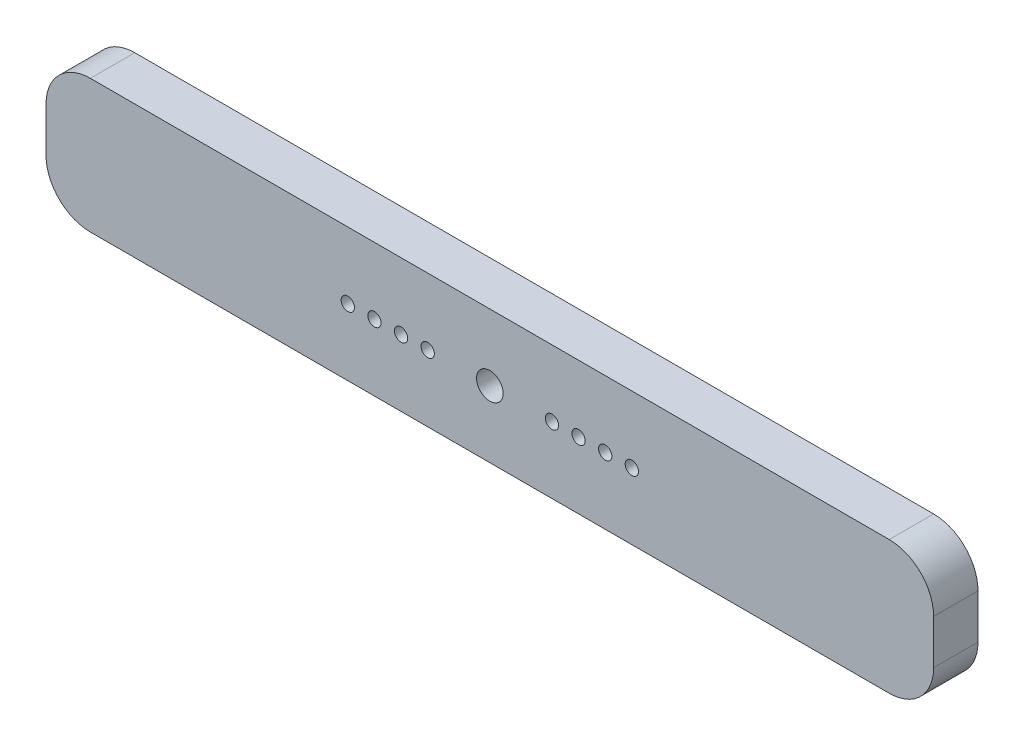
ISO-10303-21;
HEADER;
FILE_DESCRIPTION(('STEP AP214'),'2;1');
FILE_NAME('part.step','',(''),(''),'','','');
FILE_SCHEMA(('AUTOMOTIVE_DESIGN { 1 0 10303 214 1 1 1 1 }'));
ENDSEC;
DATA;
#1=APPLICATION_CONTEXT('core data for automotive mechanical design processes');
#2=APPLICATION_PROTOCOL_DEFINITION('international standard','automotive_design',2000,#1);
#3=PRODUCT_CONTEXT('',#1,'mechanical');
#4=PRODUCT('Part','Part','',(#3));
#5=PRODUCT_RELATED_PRODUCT_CATEGORY('part','',(#4));
#6=PRODUCT_DEFINITION_FORMATION('','',#4);
#7=PRODUCT_DEFINITION_CONTEXT('part definition',#1,'design');
#8=PRODUCT_DEFINITION('design','',#6,#7);
#9=PRODUCT_DEFINITION_SHAPE('','',#8);
#10=(LENGTH_UNIT() NAMED_UNIT(*) SI_UNIT(.MILLI.,.METRE.));
#11=(NAMED_UNIT(*) PLANE_ANGLE_UNIT() SI_UNIT($,.RADIAN.));
#12=(NAMED_UNIT(*) SI_UNIT($,.STERADIAN.) SOLID_ANGLE_UNIT());
#13=UNCERTAINTY_MEASURE_WITH_UNIT(LENGTH_MEASURE(1.E-05),#10,'distance_accuracy_value','');
#14=(GEOMETRIC_REPRESENTATION_CONTEXT(3) GLOBAL_UNCERTAINTY_ASSIGNED_CONTEXT((#13)) GLOBAL_UNIT_ASSIGNED_CONTEXT((#10,
#11,#12)) REPRESENTATION_CONTEXT('',''));
#15=CARTESIAN_POINT('',(0.,0.,0.));
#16=DIRECTION('',(0.,0.,1.));
#17=DIRECTION('',(1.,0.,0.));
#18=AXIS2_PLACEMENT_3D('',#15,#16,#17);
#19=CARTESIAN_POINT('',(-133.131313131313,-5.,5.));
#20=DIRECTION('',(0.,1.,0.));
#21=DIRECTION('',(0.,0.,1.));
#22=AXIS2_PLACEMENT_3D('',#19,#20,#21);
#23=PLANE('',#22);
#24=DIRECTION('',(1.,0.,0.));
#25=VECTOR('',#24,1.);
#26=CARTESIAN_POINT('',(-133.131313131313,-5.,0.));
#27=LINE('',#26,#25);
#28=CARTESIAN_POINT('',(-103.131313131313,-5.,0.));
#29=VERTEX_POINT('',#28);
#30=CARTESIAN_POINT('',(-13.1313131313131,-5.,0.));
#31=VERTEX_POINT('',#30);
#32=EDGE_CURVE('E219',#29,#31,#27,.T.);
#33=ORIENTED_EDGE('',*,*,#32,.T.);
#34=DIRECTION('',(0.,0.,-1.));
#35=VECTOR('',#34,1.);
#36=CARTESIAN_POINT('',(-13.1313131313131,-5.,5.00000000000001));
#37=LINE('',#36,#35);
#38=CARTESIAN_POINT('',(-13.1313131313131,-5.,5.));
#39=VERTEX_POINT('',#38);
#40=EDGE_CURVE('E48',#31,#39,#37,.F.);
#41=ORIENTED_EDGE('',*,*,#40,.T.);
#42=DIRECTION('',(1.,0.,0.));
#43=VECTOR('',#42,1.);
#44=CARTESIAN_POINT('',(-133.131313131313,-5.,5.));
#45=LINE('',#44,#43);
#46=CARTESIAN_POINT('',(-103.131313131313,-5.,5.));
#47=VERTEX_POINT('',#46);
#48=EDGE_CURVE('E120',#47,#39,#45,.T.);
#49=ORIENTED_EDGE('',*,*,#48,.F.);
#50=DIRECTION('',(0.,0.,-1.));
#51=VECTOR('',#50,1.);
#52=CARTESIAN_POINT('',(-103.131313131313,-5.,0.));
#53=LINE('',#52,#51);
#54=EDGE_CURVE('E109',#47,#29,#53,.T.);
#55=ORIENTED_EDGE('',*,*,#54,.T.);
#56=EDGE_LOOP('',(#33,#41,#49,#55));
#57=FACE_BOUND('',#56,.T.);
#58=ADVANCED_FACE('F33',(#57),#23,.F.);
#59=CARTESIAN_POINT('',(-133.131313131313,10.,5.));
#60=DIRECTION('',(0.,-1.,0.));
#61=DIRECTION('',(0.,0.,-1.));
#62=AXIS2_PLACEMENT_3D('',#59,#60,#61);
#63=PLANE('',#62);
#64=DIRECTION('',(-1.,0.,0.));
#65=VECTOR('',#64,1.);
#66=CARTESIAN_POINT('',(-133.131313131313,10.,5.));
#67=LINE('',#66,#65);
#68=CARTESIAN_POINT('',(-13.1313131313131,10.,5.));
#69=VERTEX_POINT('',#68);
#70=CARTESIAN_POINT('',(-103.131313131313,10.,5.));
#71=VERTEX_POINT('',#70);
#72=EDGE_CURVE('E102',#69,#71,#67,.T.);
#73=ORIENTED_EDGE('',*,*,#72,.F.);
#74=DIRECTION('',(0.,0.,-1.));
#75=VECTOR('',#74,1.);
#76=CARTESIAN_POINT('',(-13.1313131313131,10.,0.));
#77=LINE('',#76,#75);
#78=CARTESIAN_POINT('',(-13.1313131313131,10.,0.));
#79=VERTEX_POINT('',#78);
#80=EDGE_CURVE('E116',#69,#79,#77,.T.);
#81=ORIENTED_EDGE('',*,*,#80,.T.);
#82=DIRECTION('',(-1.,0.,0.));
#83=VECTOR('',#82,1.);
#84=CARTESIAN_POINT('',(-133.131313131313,10.,0.));
#85=LINE('',#84,#83);
#86=CARTESIAN_POINT('',(-103.131313131313,10.,0.));
#87=VERTEX_POINT('',#86);
#88=EDGE_CURVE('E222',#79,#87,#85,.T.);
#89=ORIENTED_EDGE('',*,*,#88,.T.);
#90=DIRECTION('',(0.,0.,-1.));
#91=VECTOR('',#90,1.);
#92=CARTESIAN_POINT('',(-103.131313131313,10.,5.00000000000001));
#93=LINE('',#92,#91);
#94=EDGE_CURVE('E119',#87,#71,#93,.F.);
#95=ORIENTED_EDGE('',*,*,#94,.T.);
#96=EDGE_LOOP('',(#73,#81,#89,#95));
#97=FACE_BOUND('',#96,.T.);
#98=ADVANCED_FACE('F114',(#97),#63,.F.);
#99=CARTESIAN_POINT('',(0.,0.,5.));
#100=DIRECTION('',(0.,0.,1.));
#101=DIRECTION('',(1.,0.,0.));
#102=AXIS2_PLACEMENT_3D('',#99,#100,#101);
#103=PLANE('',#102);
#104=CARTESIAN_POINT('',(-74.1313131313131,2.5,5.));
#105=DIRECTION('',(0.,0.,1.));
#106=DIRECTION('',(1.,0.,0.));
#107=AXIS2_PLACEMENT_3D('',#104,#105,#106);
#108=CIRCLE('',#107,0.749999999999999);
#109=CARTESIAN_POINT('',(-73.3813131313131,2.5,5.));
#110=VERTEX_POINT('',#109);
#111=EDGE_CURVE('E199',#110,#110,#108,.T.);
#112=ORIENTED_EDGE('',*,*,#111,.F.);
#113=EDGE_LOOP('',(#112));
#114=FACE_BOUND('',#113,.T.);
#115=CARTESIAN_POINT('',(-45.1313131313131,2.5,5.));
#116=DIRECTION('',(0.,0.,1.));
#117=DIRECTION('',(1.,0.,0.));
#118=AXIS2_PLACEMENT_3D('',#115,#116,#117);
#119=CIRCLE('',#118,0.749999999999999);
#120=CARTESIAN_POINT('',(-44.3813131313131,2.5,5.));
#121=VERTEX_POINT('',#120);
#122=EDGE_CURVE('E192',#121,#121,#119,.T.);
#123=ORIENTED_EDGE('',*,*,#122,.F.);
#124=EDGE_LOOP('',(#123));
#125=FACE_BOUND('',#124,.T.);
#126=CARTESIAN_POINT('',(-48.1313131313131,2.5,5.));
#127=DIRECTION('',(0.,0.,1.));
#128=DIRECTION('',(1.,0.,0.));
#129=AXIS2_PLACEMENT_3D('',#126,#127,#128);
#130=CIRCLE('',#129,0.749999999999999);
#131=CARTESIAN_POINT('',(-47.3813131313131,2.5,5.));
#132=VERTEX_POINT('',#131);
#133=EDGE_CURVE('E211',#132,#132,#130,.T.);
#134=ORIENTED_EDGE('',*,*,#133,.F.);
#135=EDGE_LOOP('',(#134));
#136=FACE_BOUND('',#135,.T.);
#137=CARTESIAN_POINT('',(-51.1313131313131,2.5,5.));
#138=DIRECTION('',(0.,0.,1.));
#139=DIRECTION('',(1.,0.,0.));
#140=AXIS2_PLACEMENT_3D('',#137,#138,#139);
#141=CIRCLE('',#140,0.749999999999999);
#142=CARTESIAN_POINT('',(-50.3813131313131,2.5,5.));
#143=VERTEX_POINT('',#142);
#144=EDGE_CURVE('E204',#143,#143,#141,.T.);
#145=ORIENTED_EDGE('',*,*,#144,.F.);
#146=EDGE_LOOP('',(#145));
#147=FACE_BOUND('',#146,.T.);
#148=CARTESIAN_POINT('',(-42.1313131313131,2.5,5.));
#149=DIRECTION('',(0.,0.,1.));
#150=DIRECTION('',(-1.,0.,0.));
#151=AXIS2_PLACEMENT_3D('',#148,#149,#150);
#152=CIRCLE('',#151,0.749999999999999);
#153=CARTESIAN_POINT('',(-42.8813131313131,2.5,5.));
#154=VERTEX_POINT('',#153);
#155=EDGE_CURVE('E175',#154,#154,#152,.T.);
#156=ORIENTED_EDGE('',*,*,#155,.F.);
#157=EDGE_LOOP('',(#156));
#158=FACE_BOUND('',#157,.T.);
#159=CARTESIAN_POINT('',(-71.1313131313131,2.49999999999999,5.));
#160=DIRECTION('',(0.,0.,1.));
#161=DIRECTION('',(-1.,0.,0.));
#162=AXIS2_PLACEMENT_3D('',#159,#160,#161);
#163=CIRCLE('',#162,0.749999999999999);
#164=CARTESIAN_POINT('',(-71.8813131313131,2.49999999999999,5.));
#165=VERTEX_POINT('',#164);
#166=EDGE_CURVE('E168',#165,#165,#163,.T.);
#167=ORIENTED_EDGE('',*,*,#166,.F.);
#168=EDGE_LOOP('',(#167));
#169=FACE_BOUND('',#168,.T.);
#170=CARTESIAN_POINT('',(-68.1313131313131,2.5,5.));
#171=DIRECTION('',(0.,0.,1.));
#172=DIRECTION('',(-1.,0.,0.));
#173=AXIS2_PLACEMENT_3D('',#170,#171,#172);
#174=CIRCLE('',#173,0.749999999999999);
#175=CARTESIAN_POINT('',(-68.8813131313131,2.5,5.));
#176=VERTEX_POINT('',#175);
#177=EDGE_CURVE('E187',#176,#176,#174,.T.);
#178=ORIENTED_EDGE('',*,*,#177,.F.);
#179=EDGE_LOOP('',(#178));
#180=FACE_BOUND('',#179,.T.);
#181=CARTESIAN_POINT('',(-65.1313131313131,2.5,5.));
#182=DIRECTION('',(0.,0.,1.));
#183=DIRECTION('',(-1.,0.,0.));
#184=AXIS2_PLACEMENT_3D('',#181,#182,#183);
#185=CIRCLE('',#184,0.749999999999999);
#186=CARTESIAN_POINT('',(-65.8813131313131,2.5,5.));
#187=VERTEX_POINT('',#186);
#188=EDGE_CURVE('E180',#187,#187,#185,.T.);
#189=ORIENTED_EDGE('',*,*,#188,.F.);
#190=EDGE_LOOP('',(#189));
#191=FACE_BOUND('',#190,.T.);
#192=CARTESIAN_POINT('',(-58.1313131313131,2.5,5.));
#193=DIRECTION('',(0.,0.,1.));
#194=DIRECTION('',(1.,0.,0.));
#195=AXIS2_PLACEMENT_3D('',#192,#193,#194);
#196=CIRCLE('',#195,1.5);
#197=CARTESIAN_POINT('',(-56.6313131313131,2.5,5.));
#198=VERTEX_POINT('',#197);
#199=EDGE_CURVE('E216',#198,#198,#196,.T.);
#200=ORIENTED_EDGE('',*,*,#199,.F.);
#201=EDGE_LOOP('',(#200));
#202=FACE_BOUND('',#201,.T.);
#203=DIRECTION('',(0.,1.,0.));
#204=VECTOR('',#203,1.);
#205=CARTESIAN_POINT('',(-8.13131313131313,0.,5.));
#206=LINE('',#205,#204);
#207=CARTESIAN_POINT('',(-8.13131313131313,0.,5.));
#208=VERTEX_POINT('',#207);
#209=CARTESIAN_POINT('',(-8.13131313131313,5.,5.));
#210=VERTEX_POINT('',#209);
#211=EDGE_CURVE('E105',#208,#210,#206,.T.);
#212=ORIENTED_EDGE('',*,*,#211,.T.);
#213=CARTESIAN_POINT('',(-13.1313131313131,5.,5.));
#214=DIRECTION('',(0.,0.,1.));
#215=DIRECTION('',(1.,0.,0.));
#216=AXIS2_PLACEMENT_3D('',#213,#214,#215);
#217=CIRCLE('',#216,5.);
#218=EDGE_CURVE('E99',#210,#69,#217,.T.);
#219=ORIENTED_EDGE('',*,*,#218,.T.);
#220=ORIENTED_EDGE('',*,*,#72,.T.);
#221=CARTESIAN_POINT('',(-103.131313131313,5.,5.));
#222=DIRECTION('',(0.,0.,1.));
#223=DIRECTION('',(1.,0.,0.));
#224=AXIS2_PLACEMENT_3D('',#221,#222,#223);
#225=CIRCLE('',#224,5.);
#226=CARTESIAN_POINT('',(-108.131313131313,5.,5.));
#227=VERTEX_POINT('',#226);
#228=EDGE_CURVE('E140',#71,#227,#225,.T.);
#229=ORIENTED_EDGE('',*,*,#228,.T.);
#230=DIRECTION('',(0.,-1.,0.));
#231=VECTOR('',#230,1.);
#232=CARTESIAN_POINT('',(-108.131313131313,0.,5.));
#233=LINE('',#232,#231);
#234=CARTESIAN_POINT('',(-108.131313131313,0.,5.));
#235=VERTEX_POINT('',#234);
#236=EDGE_CURVE('E155',#227,#235,#233,.T.);
#237=ORIENTED_EDGE('',*,*,#236,.T.);
#238=CARTESIAN_POINT('',(-103.131313131313,0.,5.));
#239=DIRECTION('',(0.,0.,1.));
#240=DIRECTION('',(1.,0.,0.));
#241=AXIS2_PLACEMENT_3D('',#238,#239,#240);
#242=CIRCLE('',#241,5.);
#243=EDGE_CURVE('E55',#235,#47,#242,.T.);
#244=ORIENTED_EDGE('',*,*,#243,.T.);
#245=ORIENTED_EDGE('',*,*,#48,.T.);
#246=CARTESIAN_POINT('',(-13.1313131313131,0.,5.));
#247=DIRECTION('',(0.,0.,1.));
#248=DIRECTION('',(1.,0.,0.));
#249=AXIS2_PLACEMENT_3D('',#246,#247,#248);
#250=CIRCLE('',#249,5.);
#251=EDGE_CURVE('E110',#39,#208,#250,.T.);
#252=ORIENTED_EDGE('',*,*,#251,.T.);
#253=EDGE_LOOP('',(#212,#219,#220,#229,#237,#244,#245,#252));
#254=FACE_BOUND('',#253,.T.);
#255=ADVANCED_FACE('F101',(#114,#125,#136,#147,#158,#169,#180,#191,#202,#254),#103,.T.);
#256=CARTESIAN_POINT('',(0.,0.,0.));
#257=DIRECTION('',(0.,0.,1.));
#258=DIRECTION('',(1.,0.,0.));
#259=AXIS2_PLACEMENT_3D('',#256,#257,#258);
#260=PLANE('',#259);
#261=CARTESIAN_POINT('',(-74.1313131313131,2.5,0.));
#262=DIRECTION('',(0.,0.,1.));
#263=DIRECTION('',(1.,0.,0.));
#264=AXIS2_PLACEMENT_3D('',#261,#262,#263);
#265=CIRCLE('',#264,0.749999999999999);
#266=CARTESIAN_POINT('',(-73.3813131313131,2.5,0.));
#267=VERTEX_POINT('',#266);
#268=EDGE_CURVE('E183',#267,#267,#265,.T.);
#269=ORIENTED_EDGE('',*,*,#268,.T.);
#270=EDGE_LOOP('',(#269));
#271=FACE_BOUND('',#270,.T.);
#272=CARTESIAN_POINT('',(-45.1313131313131,2.5,0.));
#273=DIRECTION('',(0.,0.,1.));
#274=DIRECTION('',(1.,0.,0.));
#275=AXIS2_PLACEMENT_3D('',#272,#273,#274);
#276=CIRCLE('',#275,0.749999999999999);
#277=CARTESIAN_POINT('',(-44.3813131313131,2.5,0.));
#278=VERTEX_POINT('',#277);
#279=EDGE_CURVE('E196',#278,#278,#276,.T.);
#280=ORIENTED_EDGE('',*,*,#279,.T.);
#281=EDGE_LOOP('',(#280));
#282=FACE_BOUND('',#281,.T.);
#283=CARTESIAN_POINT('',(-48.1313131313131,2.5,0.));
#284=DIRECTION('',(0.,0.,1.));
#285=DIRECTION('',(1.,0.,0.));
#286=AXIS2_PLACEMENT_3D('',#283,#284,#285);
#287=CIRCLE('',#286,0.749999999999999);
#288=CARTESIAN_POINT('',(-47.3813131313131,2.5,0.));
#289=VERTEX_POINT('',#288);
#290=EDGE_CURVE('E195',#289,#289,#287,.T.);
#291=ORIENTED_EDGE('',*,*,#290,.T.);
#292=EDGE_LOOP('',(#291));
#293=FACE_BOUND('',#292,.T.);
#294=CARTESIAN_POINT('',(-51.1313131313131,2.5,0.));
#295=DIRECTION('',(0.,0.,1.));
#296=DIRECTION('',(1.,0.,0.));
#297=AXIS2_PLACEMENT_3D('',#294,#295,#296);
#298=CIRCLE('',#297,0.749999999999999);
#299=CARTESIAN_POINT('',(-50.3813131313131,2.5,0.));
#300=VERTEX_POINT('',#299);
#301=EDGE_CURVE('E208',#300,#300,#298,.T.);
#302=ORIENTED_EDGE('',*,*,#301,.T.);
#303=EDGE_LOOP('',(#302));
#304=FACE_BOUND('',#303,.T.);
#305=CARTESIAN_POINT('',(-42.1313131313131,2.5,0.));
#306=DIRECTION('',(0.,0.,1.));
#307=DIRECTION('',(-1.,0.,0.));
#308=AXIS2_PLACEMENT_3D('',#305,#306,#307);
#309=CIRCLE('',#308,0.749999999999999);
#310=CARTESIAN_POINT('',(-42.8813131313131,2.5,0.));
#311=VERTEX_POINT('',#310);
#312=EDGE_CURVE('E167',#311,#311,#309,.T.);
#313=ORIENTED_EDGE('',*,*,#312,.T.);
#314=EDGE_LOOP('',(#313));
#315=FACE_BOUND('',#314,.T.);
#316=CARTESIAN_POINT('',(-71.1313131313131,2.49999999999999,0.));
#317=DIRECTION('',(0.,0.,1.));
#318=DIRECTION('',(-1.,0.,0.));
#319=AXIS2_PLACEMENT_3D('',#316,#317,#318);
#320=CIRCLE('',#319,0.749999999999999);
#321=CARTESIAN_POINT('',(-71.8813131313131,2.49999999999999,0.));
#322=VERTEX_POINT('',#321);
#323=EDGE_CURVE('E172',#322,#322,#320,.T.);
#324=ORIENTED_EDGE('',*,*,#323,.T.);
#325=EDGE_LOOP('',(#324));
#326=FACE_BOUND('',#325,.T.);
#327=CARTESIAN_POINT('',(-68.1313131313131,2.5,0.));
#328=DIRECTION('',(0.,0.,1.));
#329=DIRECTION('',(-1.,0.,0.));
#330=AXIS2_PLACEMENT_3D('',#327,#328,#329);
#331=CIRCLE('',#330,0.749999999999999);
#332=CARTESIAN_POINT('',(-68.8813131313131,2.5,0.));
#333=VERTEX_POINT('',#332);
#334=EDGE_CURVE('E171',#333,#333,#331,.T.);
#335=ORIENTED_EDGE('',*,*,#334,.T.);
#336=EDGE_LOOP('',(#335));
#337=FACE_BOUND('',#336,.T.);
#338=CARTESIAN_POINT('',(-65.1313131313131,2.5,0.));
#339=DIRECTION('',(0.,0.,1.));
#340=DIRECTION('',(-1.,0.,0.));
#341=AXIS2_PLACEMENT_3D('',#338,#339,#340);
#342=CIRCLE('',#341,0.749999999999999);
#343=CARTESIAN_POINT('',(-65.8813131313131,2.5,0.));
#344=VERTEX_POINT('',#343);
#345=EDGE_CURVE('E184',#344,#344,#342,.T.);
#346=ORIENTED_EDGE('',*,*,#345,.T.);
#347=EDGE_LOOP('',(#346));
#348=FACE_BOUND('',#347,.T.);
#349=CARTESIAN_POINT('',(-58.1313131313131,2.5,0.));
#350=DIRECTION('',(0.,0.,1.));
#351=DIRECTION('',(1.,0.,0.));
#352=AXIS2_PLACEMENT_3D('',#349,#350,#351);
#353=CIRCLE('',#352,1.5);
#354=CARTESIAN_POINT('',(-56.6313131313131,2.5,0.));
#355=VERTEX_POINT('',#354);
#356=EDGE_CURVE('E207',#355,#355,#353,.T.);
#357=ORIENTED_EDGE('',*,*,#356,.T.);
#358=EDGE_LOOP('',(#357));
#359=FACE_BOUND('',#358,.T.);
#360=ORIENTED_EDGE('',*,*,#88,.F.);
#361=CARTESIAN_POINT('',(-13.1313131313131,5.,0.));
#362=DIRECTION('',(0.,0.,1.));
#363=DIRECTION('',(1.,0.,0.));
#364=AXIS2_PLACEMENT_3D('',#361,#362,#363);
#365=CIRCLE('',#364,5.);
#366=CARTESIAN_POINT('',(-8.13131313131313,5.,0.));
#367=VERTEX_POINT('',#366);
#368=EDGE_CURVE('E123',#79,#367,#365,.F.);
#369=ORIENTED_EDGE('',*,*,#368,.T.);
#370=DIRECTION('',(0.,-1.,0.));
#371=VECTOR('',#370,1.);
#372=CARTESIAN_POINT('',(-8.13131313131313,10.,0.));
#373=LINE('',#372,#371);
#374=CARTESIAN_POINT('',(-8.13131313131313,0.,0.));
#375=VERTEX_POINT('',#374);
#376=EDGE_CURVE('E160',#367,#375,#373,.T.);
#377=ORIENTED_EDGE('',*,*,#376,.T.);
#378=CARTESIAN_POINT('',(-13.1313131313131,0.,0.));
#379=DIRECTION('',(0.,0.,1.));
#380=DIRECTION('',(1.,0.,0.));
#381=AXIS2_PLACEMENT_3D('',#378,#379,#380);
#382=CIRCLE('',#381,5.);
#383=EDGE_CURVE('E132',#375,#31,#382,.F.);
#384=ORIENTED_EDGE('',*,*,#383,.T.);
#385=ORIENTED_EDGE('',*,*,#32,.F.);
#386=CARTESIAN_POINT('',(-103.131313131313,0.,0.));
#387=DIRECTION('',(0.,0.,1.));
#388=DIRECTION('',(1.,0.,0.));
#389=AXIS2_PLACEMENT_3D('',#386,#387,#388);
#390=CIRCLE('',#389,5.);
#391=CARTESIAN_POINT('',(-108.131313131313,0.,0.));
#392=VERTEX_POINT('',#391);
#393=EDGE_CURVE('E126',#29,#392,#390,.F.);
#394=ORIENTED_EDGE('',*,*,#393,.T.);
#395=DIRECTION('',(0.,1.,0.));
#396=VECTOR('',#395,1.);
#397=CARTESIAN_POINT('',(-108.131313131313,10.,0.));
#398=LINE('',#397,#396);
#399=CARTESIAN_POINT('',(-108.131313131313,5.,0.));
#400=VERTEX_POINT('',#399);
#401=EDGE_CURVE('E153',#392,#400,#398,.T.);
#402=ORIENTED_EDGE('',*,*,#401,.T.);
#403=CARTESIAN_POINT('',(-103.131313131313,5.,0.));
#404=DIRECTION('',(0.,0.,1.));
#405=DIRECTION('',(1.,0.,0.));
#406=AXIS2_PLACEMENT_3D('',#403,#404,#405);
#407=CIRCLE('',#406,5.);
#408=EDGE_CURVE('E124',#400,#87,#407,.F.);
#409=ORIENTED_EDGE('',*,*,#408,.T.);
#410=EDGE_LOOP('',(#360,#369,#377,#384,#385,#394,#402,#409));
#411=FACE_BOUND('',#410,.T.);
#412=ADVANCED_FACE('F158',(#271,#282,#293,#304,#315,#326,#337,#348,#359,#411),#260,.F.);
#413=CARTESIAN_POINT('',(-58.1313131313131,2.5,5.));
#414=DIRECTION('',(0.,0.,-1.));
#415=DIRECTION('',(-1.,0.,0.));
#416=AXIS2_PLACEMENT_3D('',#413,#414,#415);
#417=CYLINDRICAL_SURFACE('',#416,1.5);
#418=ORIENTED_EDGE('',*,*,#199,.T.);
#419=EDGE_LOOP('',(#418));
#420=FACE_BOUND('',#419,.T.);
#421=ORIENTED_EDGE('',*,*,#356,.F.);
#422=EDGE_LOOP('',(#421));
#423=FACE_BOUND('',#422,.T.);
#424=ADVANCED_FACE('F299',(#420,#423),#417,.F.);
#425=CARTESIAN_POINT('',(-65.1313131313131,2.5,5.));
#426=DIRECTION('',(0.,0.,-1.));
#427=DIRECTION('',(-1.,0.,0.));
#428=AXIS2_PLACEMENT_3D('',#425,#426,#427);
#429=CYLINDRICAL_SURFACE('',#428,0.749999999999999);
#430=ORIENTED_EDGE('',*,*,#188,.T.);
#431=EDGE_LOOP('',(#430));
#432=FACE_BOUND('',#431,.T.);
#433=ORIENTED_EDGE('',*,*,#345,.F.);
#434=EDGE_LOOP('',(#433));
#435=FACE_BOUND('',#434,.T.);
#436=ADVANCED_FACE('F376',(#432,#435),#429,.F.);
#437=CARTESIAN_POINT('',(-68.1313131313131,2.5,5.));
#438=DIRECTION('',(0.,0.,-1.));
#439=DIRECTION('',(-1.,0.,0.));
#440=AXIS2_PLACEMENT_3D('',#437,#438,#439);
#441=CYLINDRICAL_SURFACE('',#440,0.749999999999999);
#442=ORIENTED_EDGE('',*,*,#177,.T.);
#443=EDGE_LOOP('',(#442));
#444=FACE_BOUND('',#443,.T.);
#445=ORIENTED_EDGE('',*,*,#334,.F.);
#446=EDGE_LOOP('',(#445));
#447=FACE_BOUND('',#446,.T.);
#448=ADVANCED_FACE('F368',(#444,#447),#441,.F.);
#449=CARTESIAN_POINT('',(-71.1313131313131,2.49999999999999,5.));
#450=DIRECTION('',(0.,0.,-1.));
#451=DIRECTION('',(-1.,0.,0.));
#452=AXIS2_PLACEMENT_3D('',#449,#450,#451);
#453=CYLINDRICAL_SURFACE('',#452,0.749999999999999);
#454=ORIENTED_EDGE('',*,*,#166,.T.);
#455=EDGE_LOOP('',(#454));
#456=FACE_BOUND('',#455,.T.);
#457=ORIENTED_EDGE('',*,*,#323,.F.);
#458=EDGE_LOOP('',(#457));
#459=FACE_BOUND('',#458,.T.);
#460=ADVANCED_FACE('F359',(#456,#459),#453,.F.);
#461=CARTESIAN_POINT('',(-42.1313131313131,2.5,5.));
#462=DIRECTION('',(0.,0.,-1.));
#463=DIRECTION('',(-1.,0.,0.));
#464=AXIS2_PLACEMENT_3D('',#461,#462,#463);
#465=CYLINDRICAL_SURFACE('',#464,0.749999999999999);
#466=ORIENTED_EDGE('',*,*,#155,.T.);
#467=EDGE_LOOP('',(#466));
#468=FACE_BOUND('',#467,.T.);
#469=ORIENTED_EDGE('',*,*,#312,.F.);
#470=EDGE_LOOP('',(#469));
#471=FACE_BOUND('',#470,.T.);
#472=ADVANCED_FACE('F350',(#468,#471),#465,.F.);
#473=CARTESIAN_POINT('',(-51.1313131313131,2.5,5.));
#474=DIRECTION('',(0.,0.,-1.));
#475=DIRECTION('',(-1.,0.,0.));
#476=AXIS2_PLACEMENT_3D('',#473,#474,#475);
#477=CYLINDRICAL_SURFACE('',#476,0.749999999999999);
#478=ORIENTED_EDGE('',*,*,#144,.T.);
#479=EDGE_LOOP('',(#478));
#480=FACE_BOUND('',#479,.T.);
#481=ORIENTED_EDGE('',*,*,#301,.F.);
#482=EDGE_LOOP('',(#481));
#483=FACE_BOUND('',#482,.T.);
#484=ADVANCED_FACE('F341',(#480,#483),#477,.F.);
#485=CARTESIAN_POINT('',(-48.1313131313131,2.5,5.));
#486=DIRECTION('',(0.,0.,-1.));
#487=DIRECTION('',(-1.,0.,0.));
#488=AXIS2_PLACEMENT_3D('',#485,#486,#487);
#489=CYLINDRICAL_SURFACE('',#488,0.749999999999999);
#490=ORIENTED_EDGE('',*,*,#133,.T.);
#491=EDGE_LOOP('',(#490));
#492=FACE_BOUND('',#491,.T.);
#493=ORIENTED_EDGE('',*,*,#290,.F.);
#494=EDGE_LOOP('',(#493));
#495=FACE_BOUND('',#494,.T.);
#496=ADVANCED_FACE('F332',(#492,#495),#489,.F.);
#497=CARTESIAN_POINT('',(-45.1313131313131,2.5,5.));
#498=DIRECTION('',(0.,0.,-1.));
#499=DIRECTION('',(-1.,0.,0.));
#500=AXIS2_PLACEMENT_3D('',#497,#498,#499);
#501=CYLINDRICAL_SURFACE('',#500,0.749999999999999);
#502=ORIENTED_EDGE('',*,*,#122,.T.);
#503=EDGE_LOOP('',(#502));
#504=FACE_BOUND('',#503,.T.);
#505=ORIENTED_EDGE('',*,*,#279,.F.);
#506=EDGE_LOOP('',(#505));
#507=FACE_BOUND('',#506,.T.);
#508=ADVANCED_FACE('F243',(#504,#507),#501,.F.);
#509=CARTESIAN_POINT('',(-74.1313131313131,2.5,5.));
#510=DIRECTION('',(0.,0.,-1.));
#511=DIRECTION('',(-1.,0.,0.));
#512=AXIS2_PLACEMENT_3D('',#509,#510,#511);
#513=CYLINDRICAL_SURFACE('',#512,0.749999999999999);
#514=ORIENTED_EDGE('',*,*,#111,.T.);
#515=EDGE_LOOP('',(#514));
#516=FACE_BOUND('',#515,.T.);
#517=ORIENTED_EDGE('',*,*,#268,.F.);
#518=EDGE_LOOP('',(#517));
#519=FACE_BOUND('',#518,.T.);
#520=ADVANCED_FACE('F235',(#516,#519),#513,.F.);
#521=CARTESIAN_POINT('',(-8.13131313131313,10.,45.));
#522=DIRECTION('',(1.,0.,0.));
#523=DIRECTION('',(0.,0.,-1.));
#524=AXIS2_PLACEMENT_3D('',#521,#522,#523);
#525=PLANE('',#524);
#526=ORIENTED_EDGE('',*,*,#376,.F.);
#527=DIRECTION('',(0.,0.,-1.));
#528=VECTOR('',#527,1.);
#529=CARTESIAN_POINT('',(-8.13131313131313,5.,5.00000000000001));
#530=LINE('',#529,#528);
#531=EDGE_CURVE('E138',#367,#210,#530,.F.);
#532=ORIENTED_EDGE('',*,*,#531,.T.);
#533=ORIENTED_EDGE('',*,*,#211,.F.);
#534=DIRECTION('',(0.,0.,-1.));
#535=VECTOR('',#534,1.);
#536=CARTESIAN_POINT('',(-8.13131313131313,0.,0.));
#537=LINE('',#536,#535);
#538=EDGE_CURVE('E135',#208,#375,#537,.T.);
#539=ORIENTED_EDGE('',*,*,#538,.T.);
#540=EDGE_LOOP('',(#526,#532,#533,#539));
#541=FACE_BOUND('',#540,.T.);
#542=ADVANCED_FACE('F233',(#541),#525,.T.);
#543=CARTESIAN_POINT('',(-108.131313131313,10.,45.));
#544=DIRECTION('',(-1.,0.,0.));
#545=DIRECTION('',(0.,0.,1.));
#546=AXIS2_PLACEMENT_3D('',#543,#544,#545);
#547=PLANE('',#546);
#548=ORIENTED_EDGE('',*,*,#401,.F.);
#549=DIRECTION('',(0.,0.,-1.));
#550=VECTOR('',#549,1.);
#551=CARTESIAN_POINT('',(-108.131313131313,0.,5.00000000000001));
#552=LINE('',#551,#550);
#553=EDGE_CURVE('E11',#392,#235,#552,.F.);
#554=ORIENTED_EDGE('',*,*,#553,.T.);
#555=ORIENTED_EDGE('',*,*,#236,.F.);
#556=DIRECTION('',(0.,0.,-1.));
#557=VECTOR('',#556,1.);
#558=CARTESIAN_POINT('',(-108.131313131313,5.,0.));
#559=LINE('',#558,#557);
#560=EDGE_CURVE('E41',#227,#400,#559,.T.);
#561=ORIENTED_EDGE('',*,*,#560,.T.);
#562=EDGE_LOOP('',(#548,#554,#555,#561));
#563=FACE_BOUND('',#562,.T.);
#564=ADVANCED_FACE('F152',(#563),#547,.T.);
#565=CARTESIAN_POINT('',(-13.1313131313131,5.,5.));
#566=DIRECTION('',(0.,0.,1.));
#567=DIRECTION('',(1.,0.,0.));
#568=AXIS2_PLACEMENT_3D('',#565,#566,#567);
#569=CYLINDRICAL_SURFACE('',#568,5.);
#570=ORIENTED_EDGE('',*,*,#218,.F.);
#571=ORIENTED_EDGE('',*,*,#531,.F.);
#572=ORIENTED_EDGE('',*,*,#368,.F.);
#573=ORIENTED_EDGE('',*,*,#80,.F.);
#574=EDGE_LOOP('',(#570,#571,#572,#573));
#575=FACE_BOUND('',#574,.T.);
#576=ADVANCED_FACE('F122',(#575),#569,.T.);
#577=CARTESIAN_POINT('',(-13.1313131313131,0.,45.));
#578=DIRECTION('',(0.,0.,1.));
#579=DIRECTION('',(1.,0.,0.));
#580=AXIS2_PLACEMENT_3D('',#577,#578,#579);
#581=CYLINDRICAL_SURFACE('',#580,5.);
#582=ORIENTED_EDGE('',*,*,#251,.F.);
#583=ORIENTED_EDGE('',*,*,#40,.F.);
#584=ORIENTED_EDGE('',*,*,#383,.F.);
#585=ORIENTED_EDGE('',*,*,#538,.F.);
#586=EDGE_LOOP('',(#582,#583,#584,#585));
#587=FACE_BOUND('',#586,.T.);
#588=ADVANCED_FACE('F231',(#587),#581,.T.);
#589=CARTESIAN_POINT('',(-103.131313131313,0.,5.));
#590=DIRECTION('',(0.,0.,1.));
#591=DIRECTION('',(1.,0.,0.));
#592=AXIS2_PLACEMENT_3D('',#589,#590,#591);
#593=CYLINDRICAL_SURFACE('',#592,5.);
#594=ORIENTED_EDGE('',*,*,#243,.F.);
#595=ORIENTED_EDGE('',*,*,#553,.F.);
#596=ORIENTED_EDGE('',*,*,#393,.F.);
#597=ORIENTED_EDGE('',*,*,#54,.F.);
#598=EDGE_LOOP('',(#594,#595,#596,#597));
#599=FACE_BOUND('',#598,.T.);
#600=ADVANCED_FACE('F226',(#599),#593,.T.);
#601=CARTESIAN_POINT('',(-103.131313131313,5.,45.));
#602=DIRECTION('',(0.,0.,1.));
#603=DIRECTION('',(1.,0.,0.));
#604=AXIS2_PLACEMENT_3D('',#601,#602,#603);
#605=CYLINDRICAL_SURFACE('',#604,5.);
#606=ORIENTED_EDGE('',*,*,#228,.F.);
#607=ORIENTED_EDGE('',*,*,#94,.F.);
#608=ORIENTED_EDGE('',*,*,#408,.F.);
#609=ORIENTED_EDGE('',*,*,#560,.F.);
#610=EDGE_LOOP('',(#606,#607,#608,#609));
#611=FACE_BOUND('',#610,.T.);
#612=ADVANCED_FACE('F35',(#611),#605,.T.);
#613=CLOSED_SHELL('',(#58,#98,#255,#412,#424,#436,#448,#460,#472,#484,#496,#508,#520,#542,#564,
#576,#588,#600,#612));
#614=MANIFOLD_SOLID_BREP('B2',#613);
#615=ADVANCED_BREP_SHAPE_REPRESENTATION('',(#18,#614),#14);
#616=SHAPE_DEFINITION_REPRESENTATION(#9,#615);
ENDSEC;
END-ISO-10303-21;
